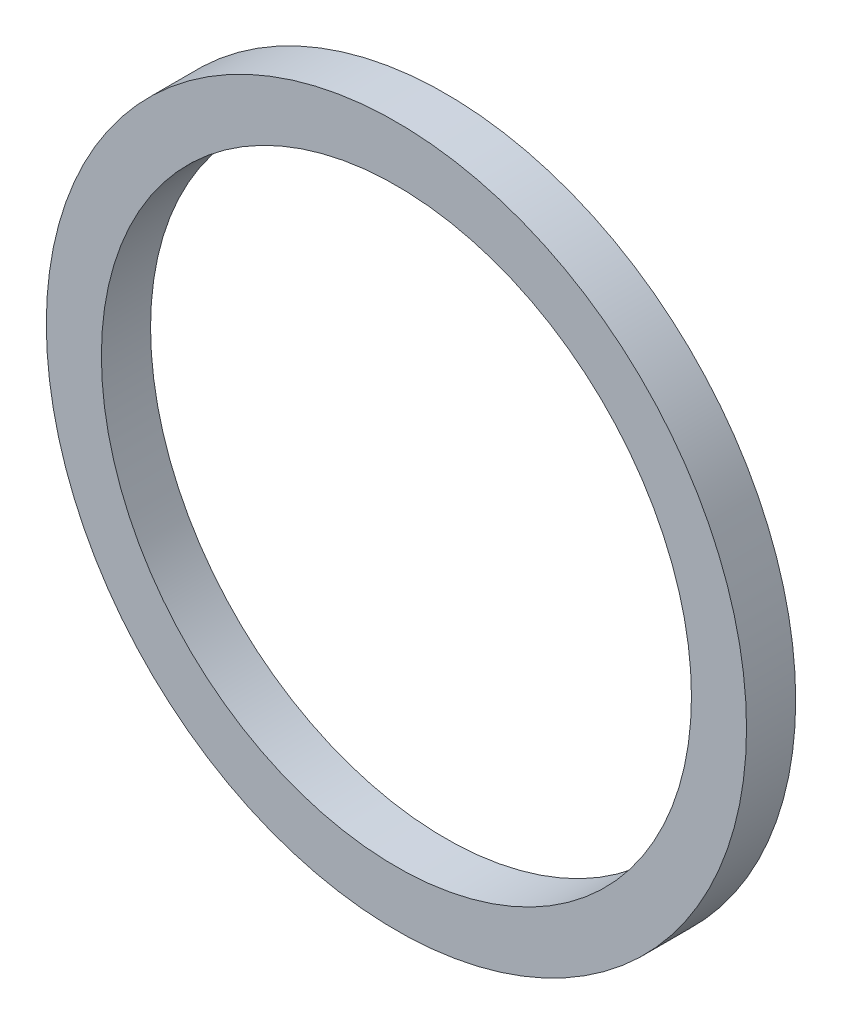
ISO-10303-21;
HEADER;
FILE_DESCRIPTION(('STEP AP214'),'2;1');
FILE_NAME('part.step','',(''),(''),'','','');
FILE_SCHEMA(('AUTOMOTIVE_DESIGN { 1 0 10303 214 1 1 1 1 }'));
ENDSEC;
DATA;
#1=APPLICATION_CONTEXT('core data for automotive mechanical design processes');
#2=APPLICATION_PROTOCOL_DEFINITION('international standard','automotive_design',2000,#1);
#3=PRODUCT_CONTEXT('',#1,'mechanical');
#4=PRODUCT('Part','Part','',(#3));
#5=PRODUCT_RELATED_PRODUCT_CATEGORY('part','',(#4));
#6=PRODUCT_DEFINITION_FORMATION('','',#4);
#7=PRODUCT_DEFINITION_CONTEXT('part definition',#1,'design');
#8=PRODUCT_DEFINITION('design','',#6,#7);
#9=PRODUCT_DEFINITION_SHAPE('','',#8);
#10=(LENGTH_UNIT() NAMED_UNIT(*) SI_UNIT(.MILLI.,.METRE.));
#11=(NAMED_UNIT(*) PLANE_ANGLE_UNIT() SI_UNIT($,.RADIAN.));
#12=(NAMED_UNIT(*) SI_UNIT($,.STERADIAN.) SOLID_ANGLE_UNIT());
#13=UNCERTAINTY_MEASURE_WITH_UNIT(LENGTH_MEASURE(1.E-05),#10,'distance_accuracy_value','');
#14=(GEOMETRIC_REPRESENTATION_CONTEXT(3) GLOBAL_UNCERTAINTY_ASSIGNED_CONTEXT((#13)) GLOBAL_UNIT_ASSIGNED_CONTEXT((#10,
#11,#12)) REPRESENTATION_CONTEXT('',''));
#15=CARTESIAN_POINT('',(0.,0.,0.));
#16=DIRECTION('',(0.,0.,1.));
#17=DIRECTION('',(1.,0.,0.));
#18=AXIS2_PLACEMENT_3D('',#15,#16,#17);
#19=CARTESIAN_POINT('',(0.,0.,3.175));
#20=DIRECTION('',(0.,0.,1.));
#21=DIRECTION('',(1.,0.,0.));
#22=AXIS2_PLACEMENT_3D('',#19,#20,#21);
#23=PLANE('',#22);
#24=CARTESIAN_POINT('',(0.,0.,3.175));
#25=DIRECTION('',(0.,0.,1.));
#26=DIRECTION('',(1.,0.,0.));
#27=AXIS2_PLACEMENT_3D('',#24,#25,#26);
#28=CIRCLE('',#27,22.606);
#29=CARTESIAN_POINT('',(22.606,0.,3.175));
#30=VERTEX_POINT('',#29);
#31=EDGE_CURVE('E10',#30,#30,#28,.T.);
#32=ORIENTED_EDGE('',*,*,#31,.T.);
#33=EDGE_LOOP('',(#32));
#34=FACE_BOUND('',#33,.T.);
#35=CARTESIAN_POINT('',(0.,0.,3.175));
#36=DIRECTION('',(0.,0.,1.));
#37=DIRECTION('',(1.,0.,0.));
#38=AXIS2_PLACEMENT_3D('',#35,#36,#37);
#39=CIRCLE('',#38,19.05);
#40=CARTESIAN_POINT('',(19.05,0.,3.175));
#41=VERTEX_POINT('',#40);
#42=EDGE_CURVE('E41',#41,#41,#39,.T.);
#43=ORIENTED_EDGE('',*,*,#42,.F.);
#44=EDGE_LOOP('',(#43));
#45=FACE_BOUND('',#44,.T.);
#46=ADVANCED_FACE('F30',(#34,#45),#23,.T.);
#47=CARTESIAN_POINT('',(0.,0.,0.));
#48=DIRECTION('',(0.,0.,1.));
#49=DIRECTION('',(1.,0.,0.));
#50=AXIS2_PLACEMENT_3D('',#47,#48,#49);
#51=PLANE('',#50);
#52=CARTESIAN_POINT('',(0.,0.,0.));
#53=DIRECTION('',(0.,0.,1.));
#54=DIRECTION('',(1.,0.,0.));
#55=AXIS2_PLACEMENT_3D('',#52,#53,#54);
#56=CIRCLE('',#55,22.606);
#57=CARTESIAN_POINT('',(22.606,0.,0.));
#58=VERTEX_POINT('',#57);
#59=EDGE_CURVE('E34',#58,#58,#56,.T.);
#60=ORIENTED_EDGE('',*,*,#59,.F.);
#61=EDGE_LOOP('',(#60));
#62=FACE_BOUND('',#61,.T.);
#63=CARTESIAN_POINT('',(0.,0.,0.));
#64=DIRECTION('',(0.,0.,1.));
#65=DIRECTION('',(1.,0.,0.));
#66=AXIS2_PLACEMENT_3D('',#63,#64,#65);
#67=CIRCLE('',#66,19.05);
#68=CARTESIAN_POINT('',(19.05,0.,0.));
#69=VERTEX_POINT('',#68);
#70=EDGE_CURVE('E43',#69,#69,#67,.T.);
#71=ORIENTED_EDGE('',*,*,#70,.T.);
#72=EDGE_LOOP('',(#71));
#73=FACE_BOUND('',#72,.T.);
#74=ADVANCED_FACE('F53',(#62,#73),#51,.F.);
#75=CARTESIAN_POINT('',(0.,0.,3.175));
#76=DIRECTION('',(0.,0.,-1.));
#77=DIRECTION('',(-1.,0.,0.));
#78=AXIS2_PLACEMENT_3D('',#75,#76,#77);
#79=CYLINDRICAL_SURFACE('',#78,22.606);
#80=ORIENTED_EDGE('',*,*,#31,.F.);
#81=EDGE_LOOP('',(#80));
#82=FACE_BOUND('',#81,.T.);
#83=ORIENTED_EDGE('',*,*,#59,.T.);
#84=EDGE_LOOP('',(#83));
#85=FACE_BOUND('',#84,.T.);
#86=ADVANCED_FACE('F32',(#82,#85),#79,.T.);
#87=CARTESIAN_POINT('',(0.,0.,3.175));
#88=DIRECTION('',(0.,0.,-1.));
#89=DIRECTION('',(-1.,0.,0.));
#90=AXIS2_PLACEMENT_3D('',#87,#88,#89);
#91=CYLINDRICAL_SURFACE('',#90,19.05);
#92=ORIENTED_EDGE('',*,*,#42,.T.);
#93=EDGE_LOOP('',(#92));
#94=FACE_BOUND('',#93,.T.);
#95=ORIENTED_EDGE('',*,*,#70,.F.);
#96=EDGE_LOOP('',(#95));
#97=FACE_BOUND('',#96,.T.);
#98=ADVANCED_FACE('F49',(#94,#97),#91,.F.);
#99=CLOSED_SHELL('',(#46,#74,#86,#98));
#100=MANIFOLD_SOLID_BREP('B2',#99);
#101=ADVANCED_BREP_SHAPE_REPRESENTATION('',(#18,#100),#14);
#102=SHAPE_DEFINITION_REPRESENTATION(#9,#101);
ENDSEC;
END-ISO-10303-21;
